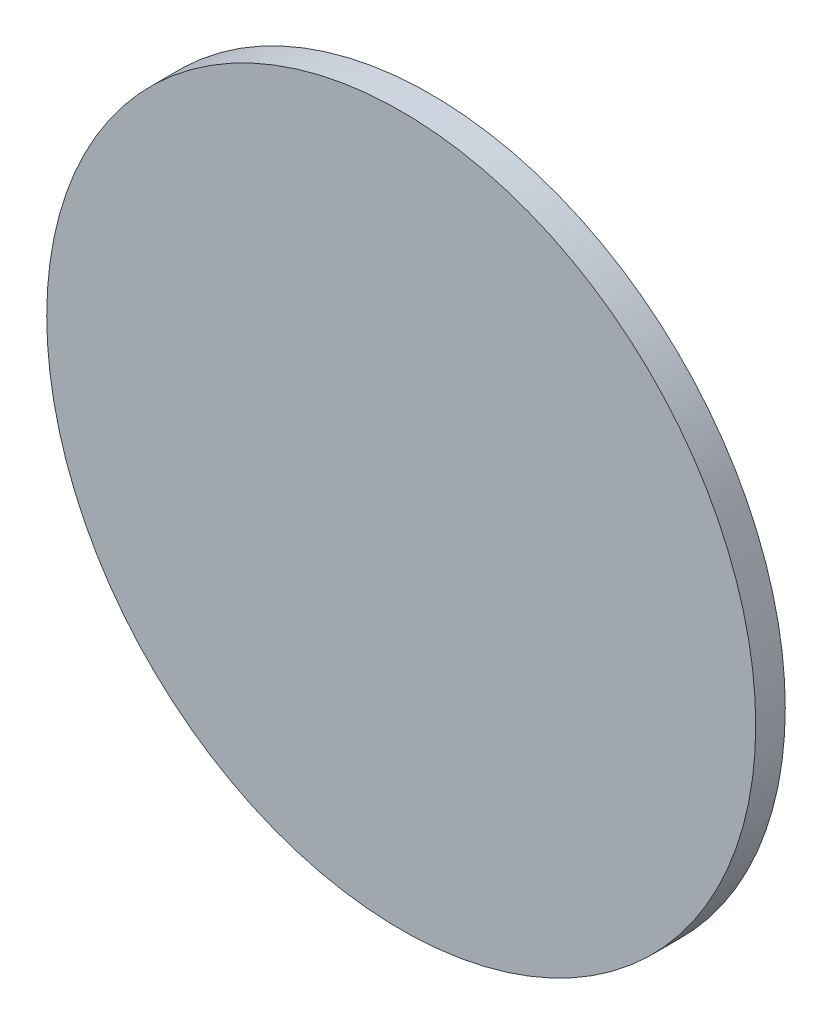
ISO-10303-21;
HEADER;
FILE_DESCRIPTION(('STEP AP214'),'2;1');
FILE_NAME('part.step','',(''),(''),'','','');
FILE_SCHEMA(('AUTOMOTIVE_DESIGN { 1 0 10303 214 1 1 1 1 }'));
ENDSEC;
DATA;
#1=APPLICATION_CONTEXT('core data for automotive mechanical design processes');
#2=APPLICATION_PROTOCOL_DEFINITION('international standard','automotive_design',2000,#1);
#3=PRODUCT_CONTEXT('',#1,'mechanical');
#4=PRODUCT('Part','Part','',(#3));
#5=PRODUCT_RELATED_PRODUCT_CATEGORY('part','',(#4));
#6=PRODUCT_DEFINITION_FORMATION('','',#4);
#7=PRODUCT_DEFINITION_CONTEXT('part definition',#1,'design');
#8=PRODUCT_DEFINITION('design','',#6,#7);
#9=PRODUCT_DEFINITION_SHAPE('','',#8);
#10=(LENGTH_UNIT() NAMED_UNIT(*) SI_UNIT(.MILLI.,.METRE.));
#11=(NAMED_UNIT(*) PLANE_ANGLE_UNIT() SI_UNIT($,.RADIAN.));
#12=(NAMED_UNIT(*) SI_UNIT($,.STERADIAN.) SOLID_ANGLE_UNIT());
#13=UNCERTAINTY_MEASURE_WITH_UNIT(LENGTH_MEASURE(1.E-05),#10,'distance_accuracy_value','');
#14=(GEOMETRIC_REPRESENTATION_CONTEXT(3) GLOBAL_UNCERTAINTY_ASSIGNED_CONTEXT((#13)) GLOBAL_UNIT_ASSIGNED_CONTEXT((#10,
#11,#12)) REPRESENTATION_CONTEXT('',''));
#15=CARTESIAN_POINT('',(0.,0.,0.));
#16=DIRECTION('',(0.,0.,1.));
#17=DIRECTION('',(1.,0.,0.));
#18=AXIS2_PLACEMENT_3D('',#15,#16,#17);
#19=CARTESIAN_POINT('',(0.,0.,1.5875));
#20=DIRECTION('',(0.,0.,-1.));
#21=DIRECTION('',(-1.,0.,0.));
#22=AXIS2_PLACEMENT_3D('',#19,#20,#21);
#23=CYLINDRICAL_SURFACE('',#22,38.1);
#24=CARTESIAN_POINT('',(0.,0.,1.5875));
#25=DIRECTION('',(0.,0.,1.));
#26=DIRECTION('',(1.,0.,0.));
#27=AXIS2_PLACEMENT_3D('',#24,#25,#26);
#28=CIRCLE('',#27,38.1);
#29=CARTESIAN_POINT('',(38.1,0.,1.5875));
#30=VERTEX_POINT('',#29);
#31=EDGE_CURVE('E10',#30,#30,#28,.T.);
#32=ORIENTED_EDGE('',*,*,#31,.F.);
#33=EDGE_LOOP('',(#32));
#34=FACE_BOUND('',#33,.T.);
#35=CARTESIAN_POINT('',(0.,0.,-1.5875));
#36=DIRECTION('',(0.,0.,1.));
#37=DIRECTION('',(1.,0.,0.));
#38=AXIS2_PLACEMENT_3D('',#35,#36,#37);
#39=CIRCLE('',#38,38.1);
#40=CARTESIAN_POINT('',(38.1,0.,-1.5875));
#41=VERTEX_POINT('',#40);
#42=EDGE_CURVE('E34',#41,#41,#39,.T.);
#43=ORIENTED_EDGE('',*,*,#42,.T.);
#44=EDGE_LOOP('',(#43));
#45=FACE_BOUND('',#44,.T.);
#46=ADVANCED_FACE('F31',(#34,#45),#23,.T.);
#47=CARTESIAN_POINT('',(0.,0.,1.5875));
#48=DIRECTION('',(0.,0.,1.));
#49=DIRECTION('',(1.,0.,0.));
#50=AXIS2_PLACEMENT_3D('',#47,#48,#49);
#51=PLANE('',#50);
#52=ORIENTED_EDGE('',*,*,#31,.T.);
#53=EDGE_LOOP('',(#52));
#54=FACE_BOUND('',#53,.T.);
#55=ADVANCED_FACE('F46',(#54),#51,.T.);
#56=CARTESIAN_POINT('',(0.,0.,-1.5875));
#57=DIRECTION('',(0.,0.,1.));
#58=DIRECTION('',(1.,0.,0.));
#59=AXIS2_PLACEMENT_3D('',#56,#57,#58);
#60=PLANE('',#59);
#61=ORIENTED_EDGE('',*,*,#42,.F.);
#62=EDGE_LOOP('',(#61));
#63=FACE_BOUND('',#62,.T.);
#64=ADVANCED_FACE('F44',(#63),#60,.F.);
#65=CLOSED_SHELL('',(#46,#55,#64));
#66=MANIFOLD_SOLID_BREP('B2',#65);
#67=ADVANCED_BREP_SHAPE_REPRESENTATION('',(#18,#66),#14);
#68=SHAPE_DEFINITION_REPRESENTATION(#9,#67);
ENDSEC;
END-ISO-10303-21;
